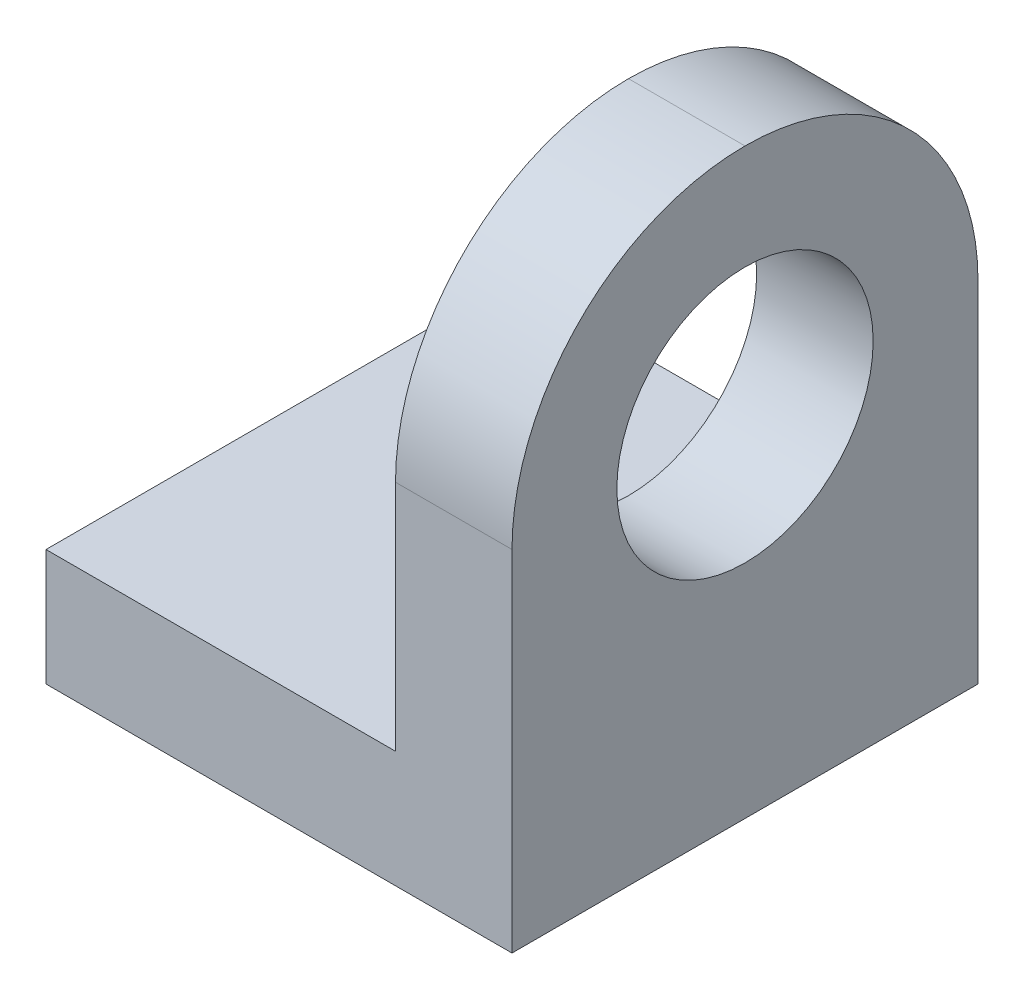
ISO-10303-21;
HEADER;
FILE_DESCRIPTION(('STEP AP214'),'2;1');
FILE_NAME('part.step','',(''),(''),'','','');
FILE_SCHEMA(('AUTOMOTIVE_DESIGN { 1 0 10303 214 1 1 1 1 }'));
ENDSEC;
DATA;
#1=APPLICATION_CONTEXT('core data for automotive mechanical design processes');
#2=APPLICATION_PROTOCOL_DEFINITION('international standard','automotive_design',2000,#1);
#3=PRODUCT_CONTEXT('',#1,'mechanical');
#4=PRODUCT('Part','Part','',(#3));
#5=PRODUCT_RELATED_PRODUCT_CATEGORY('part','',(#4));
#6=PRODUCT_DEFINITION_FORMATION('','',#4);
#7=PRODUCT_DEFINITION_CONTEXT('part definition',#1,'design');
#8=PRODUCT_DEFINITION('design','',#6,#7);
#9=PRODUCT_DEFINITION_SHAPE('','',#8);
#10=(LENGTH_UNIT() NAMED_UNIT(*) SI_UNIT(.MILLI.,.METRE.));
#11=(NAMED_UNIT(*) PLANE_ANGLE_UNIT() SI_UNIT($,.RADIAN.));
#12=(NAMED_UNIT(*) SI_UNIT($,.STERADIAN.) SOLID_ANGLE_UNIT());
#13=UNCERTAINTY_MEASURE_WITH_UNIT(LENGTH_MEASURE(1.E-05),#10,'distance_accuracy_value','');
#14=(GEOMETRIC_REPRESENTATION_CONTEXT(3) GLOBAL_UNCERTAINTY_ASSIGNED_CONTEXT((#13)) GLOBAL_UNIT_ASSIGNED_CONTEXT((#10,
#11,#12)) REPRESENTATION_CONTEXT('',''));
#15=CARTESIAN_POINT('',(0.,0.,0.));
#16=DIRECTION('',(0.,0.,1.));
#17=DIRECTION('',(1.,0.,0.));
#18=AXIS2_PLACEMENT_3D('',#15,#16,#17);
#19=CARTESIAN_POINT('',(9.99999999999999,5.,-10.));
#20=DIRECTION('',(-1.,0.,0.));
#21=DIRECTION('',(0.,0.,1.));
#22=AXIS2_PLACEMENT_3D('',#19,#20,#21);
#23=PLANE('',#22);
#24=CARTESIAN_POINT('',(10.,15.,0.));
#25=DIRECTION('',(1.,0.,0.));
#26=DIRECTION('',(0.,0.,-1.));
#27=AXIS2_PLACEMENT_3D('',#24,#25,#26);
#28=CIRCLE('',#27,5.5);
#29=CARTESIAN_POINT('',(10.,15.,-5.5));
#30=VERTEX_POINT('',#29);
#31=EDGE_CURVE('E120',#30,#30,#28,.T.);
#32=ORIENTED_EDGE('',*,*,#31,.F.);
#33=EDGE_LOOP('',(#32));
#34=FACE_BOUND('',#33,.T.);
#35=DIRECTION('',(0.,-1.,0.));
#36=VECTOR('',#35,1.);
#37=CARTESIAN_POINT('',(9.99999999999999,5.,-10.));
#38=LINE('',#37,#36);
#39=CARTESIAN_POINT('',(9.99999999999999,15.,-10.));
#40=VERTEX_POINT('',#39);
#41=CARTESIAN_POINT('',(9.99999999999999,0.,-10.));
#42=VERTEX_POINT('',#41);
#43=EDGE_CURVE('E145',#40,#42,#38,.T.);
#44=ORIENTED_EDGE('',*,*,#43,.F.);
#45=CARTESIAN_POINT('',(10.,15.,0.));
#46=DIRECTION('',(-1.,0.,0.));
#47=DIRECTION('',(0.,0.,1.));
#48=AXIS2_PLACEMENT_3D('',#45,#46,#47);
#49=CIRCLE('',#48,10.);
#50=CARTESIAN_POINT('',(10.,25.,0.));
#51=VERTEX_POINT('',#50);
#52=EDGE_CURVE('E50',#40,#51,#49,.F.);
#53=ORIENTED_EDGE('',*,*,#52,.T.);
#54=CARTESIAN_POINT('',(10.,15.,0.));
#55=DIRECTION('',(-1.,0.,0.));
#56=DIRECTION('',(0.,0.,1.));
#57=AXIS2_PLACEMENT_3D('',#54,#55,#56);
#58=CIRCLE('',#57,10.);
#59=CARTESIAN_POINT('',(10.,15.,10.));
#60=VERTEX_POINT('',#59);
#61=EDGE_CURVE('E53',#51,#60,#58,.F.);
#62=ORIENTED_EDGE('',*,*,#61,.T.);
#63=DIRECTION('',(0.,-1.,0.));
#64=VECTOR('',#63,1.);
#65=CARTESIAN_POINT('',(10.,5.,10.));
#66=LINE('',#65,#64);
#67=CARTESIAN_POINT('',(10.,0.,10.));
#68=VERTEX_POINT('',#67);
#69=EDGE_CURVE('E114',#60,#68,#66,.T.);
#70=ORIENTED_EDGE('',*,*,#69,.T.);
#71=DIRECTION('',(0.,0.,-1.));
#72=VECTOR('',#71,1.);
#73=CARTESIAN_POINT('',(9.99999999999999,0.,-10.));
#74=LINE('',#73,#72);
#75=EDGE_CURVE('E123',#68,#42,#74,.T.);
#76=ORIENTED_EDGE('',*,*,#75,.T.);
#77=EDGE_LOOP('',(#44,#53,#62,#70,#76));
#78=FACE_BOUND('',#77,.T.);
#79=ADVANCED_FACE('F36',(#34,#78),#23,.F.);
#80=CARTESIAN_POINT('',(-10.,5.,-10.));
#81=DIRECTION('',(0.,0.,1.));
#82=DIRECTION('',(1.,0.,0.));
#83=AXIS2_PLACEMENT_3D('',#80,#81,#82);
#84=PLANE('',#83);
#85=DIRECTION('',(0.,-1.,0.));
#86=VECTOR('',#85,1.);
#87=CARTESIAN_POINT('',(5.,25.,-10.));
#88=LINE('',#87,#86);
#89=CARTESIAN_POINT('',(5.,15.,-10.));
#90=VERTEX_POINT('',#89);
#91=CARTESIAN_POINT('',(5.,5.,-10.));
#92=VERTEX_POINT('',#91);
#93=EDGE_CURVE('E103',#90,#92,#88,.T.);
#94=ORIENTED_EDGE('',*,*,#93,.F.);
#95=DIRECTION('',(-1.,0.,0.));
#96=VECTOR('',#95,1.);
#97=CARTESIAN_POINT('',(-10.,15.,-10.));
#98=LINE('',#97,#96);
#99=EDGE_CURVE('E147',#90,#40,#98,.F.);
#100=ORIENTED_EDGE('',*,*,#99,.T.);
#101=ORIENTED_EDGE('',*,*,#43,.T.);
#102=DIRECTION('',(-1.,0.,0.));
#103=VECTOR('',#102,1.);
#104=CARTESIAN_POINT('',(-10.,0.,-10.));
#105=LINE('',#104,#103);
#106=CARTESIAN_POINT('',(-10.,0.,-10.));
#107=VERTEX_POINT('',#106);
#108=EDGE_CURVE('E132',#42,#107,#105,.T.);
#109=ORIENTED_EDGE('',*,*,#108,.T.);
#110=DIRECTION('',(0.,-1.,0.));
#111=VECTOR('',#110,1.);
#112=CARTESIAN_POINT('',(-10.,5.,-10.));
#113=LINE('',#112,#111);
#114=CARTESIAN_POINT('',(-10.,5.,-10.));
#115=VERTEX_POINT('',#114);
#116=EDGE_CURVE('E143',#115,#107,#113,.T.);
#117=ORIENTED_EDGE('',*,*,#116,.F.);
#118=DIRECTION('',(-1.,0.,0.));
#119=VECTOR('',#118,1.);
#120=CARTESIAN_POINT('',(-10.,5.,-10.));
#121=LINE('',#120,#119);
#122=EDGE_CURVE('E127',#92,#115,#121,.T.);
#123=ORIENTED_EDGE('',*,*,#122,.F.);
#124=EDGE_LOOP('',(#94,#100,#101,#109,#117,#123));
#125=FACE_BOUND('',#124,.T.);
#126=ADVANCED_FACE('F156',(#125),#84,.F.);
#127=CARTESIAN_POINT('',(-10.,5.,-10.));
#128=DIRECTION('',(1.,0.,0.));
#129=DIRECTION('',(0.,0.,-1.));
#130=AXIS2_PLACEMENT_3D('',#127,#128,#129);
#131=PLANE('',#130);
#132=DIRECTION('',(0.,0.,1.));
#133=VECTOR('',#132,1.);
#134=CARTESIAN_POINT('',(-10.,0.,-10.));
#135=LINE('',#134,#133);
#136=CARTESIAN_POINT('',(-10.,0.,10.));
#137=VERTEX_POINT('',#136);
#138=EDGE_CURVE('E133',#107,#137,#135,.T.);
#139=ORIENTED_EDGE('',*,*,#138,.T.);
#140=DIRECTION('',(0.,-1.,0.));
#141=VECTOR('',#140,1.);
#142=CARTESIAN_POINT('',(-10.,5.,10.));
#143=LINE('',#142,#141);
#144=CARTESIAN_POINT('',(-10.,5.,10.));
#145=VERTEX_POINT('',#144);
#146=EDGE_CURVE('E136',#145,#137,#143,.T.);
#147=ORIENTED_EDGE('',*,*,#146,.F.);
#148=DIRECTION('',(0.,0.,1.));
#149=VECTOR('',#148,1.);
#150=CARTESIAN_POINT('',(-10.,5.,-10.));
#151=LINE('',#150,#149);
#152=EDGE_CURVE('E112',#115,#145,#151,.T.);
#153=ORIENTED_EDGE('',*,*,#152,.F.);
#154=ORIENTED_EDGE('',*,*,#116,.T.);
#155=EDGE_LOOP('',(#139,#147,#153,#154));
#156=FACE_BOUND('',#155,.T.);
#157=ADVANCED_FACE('F170',(#156),#131,.F.);
#158=CARTESIAN_POINT('',(-10.,5.,10.));
#159=DIRECTION('',(0.,0.,-1.));
#160=DIRECTION('',(-1.,0.,0.));
#161=AXIS2_PLACEMENT_3D('',#158,#159,#160);
#162=PLANE('',#161);
#163=ORIENTED_EDGE('',*,*,#69,.F.);
#164=DIRECTION('',(1.,0.,0.));
#165=VECTOR('',#164,1.);
#166=CARTESIAN_POINT('',(-10.,15.,10.));
#167=LINE('',#166,#165);
#168=CARTESIAN_POINT('',(5.,15.,10.));
#169=VERTEX_POINT('',#168);
#170=EDGE_CURVE('E11',#60,#169,#167,.F.);
#171=ORIENTED_EDGE('',*,*,#170,.T.);
#172=DIRECTION('',(0.,-1.,0.));
#173=VECTOR('',#172,1.);
#174=CARTESIAN_POINT('',(5.,25.,10.));
#175=LINE('',#174,#173);
#176=CARTESIAN_POINT('',(5.,5.,10.));
#177=VERTEX_POINT('',#176);
#178=EDGE_CURVE('E94',#169,#177,#175,.T.);
#179=ORIENTED_EDGE('',*,*,#178,.T.);
#180=DIRECTION('',(1.,0.,0.));
#181=VECTOR('',#180,1.);
#182=CARTESIAN_POINT('',(-10.,5.,10.));
#183=LINE('',#182,#181);
#184=EDGE_CURVE('E98',#145,#177,#183,.T.);
#185=ORIENTED_EDGE('',*,*,#184,.F.);
#186=ORIENTED_EDGE('',*,*,#146,.T.);
#187=DIRECTION('',(1.,0.,0.));
#188=VECTOR('',#187,1.);
#189=CARTESIAN_POINT('',(-10.,0.,10.));
#190=LINE('',#189,#188);
#191=EDGE_CURVE('E126',#137,#68,#190,.T.);
#192=ORIENTED_EDGE('',*,*,#191,.T.);
#193=EDGE_LOOP('',(#163,#171,#179,#185,#186,#192));
#194=FACE_BOUND('',#193,.T.);
#195=ADVANCED_FACE('F96',(#194),#162,.F.);
#196=CARTESIAN_POINT('',(0.,5.,0.));
#197=DIRECTION('',(0.,1.,0.));
#198=DIRECTION('',(0.,0.,1.));
#199=AXIS2_PLACEMENT_3D('',#196,#197,#198);
#200=PLANE('',#199);
#201=DIRECTION('',(0.,0.,1.));
#202=VECTOR('',#201,1.);
#203=CARTESIAN_POINT('',(5.,5.,-10.));
#204=LINE('',#203,#202);
#205=EDGE_CURVE('E102',#92,#177,#204,.T.);
#206=ORIENTED_EDGE('',*,*,#205,.F.);
#207=ORIENTED_EDGE('',*,*,#122,.T.);
#208=ORIENTED_EDGE('',*,*,#152,.T.);
#209=ORIENTED_EDGE('',*,*,#184,.T.);
#210=EDGE_LOOP('',(#206,#207,#208,#209));
#211=FACE_BOUND('',#210,.T.);
#212=ADVANCED_FACE('F107',(#211),#200,.T.);
#213=CARTESIAN_POINT('',(0.,0.,0.));
#214=DIRECTION('',(0.,1.,0.));
#215=DIRECTION('',(0.,0.,1.));
#216=AXIS2_PLACEMENT_3D('',#213,#214,#215);
#217=PLANE('',#216);
#218=ORIENTED_EDGE('',*,*,#75,.F.);
#219=ORIENTED_EDGE('',*,*,#191,.F.);
#220=ORIENTED_EDGE('',*,*,#138,.F.);
#221=ORIENTED_EDGE('',*,*,#108,.F.);
#222=EDGE_LOOP('',(#218,#219,#220,#221));
#223=FACE_BOUND('',#222,.T.);
#224=ADVANCED_FACE('F162',(#223),#217,.F.);
#225=CARTESIAN_POINT('',(5.,25.,-10.));
#226=DIRECTION('',(1.,0.,0.));
#227=DIRECTION('',(0.,0.,-1.));
#228=AXIS2_PLACEMENT_3D('',#225,#226,#227);
#229=PLANE('',#228);
#230=CARTESIAN_POINT('',(5.,15.,0.));
#231=DIRECTION('',(1.,0.,0.));
#232=DIRECTION('',(0.,0.,-1.));
#233=AXIS2_PLACEMENT_3D('',#230,#231,#232);
#234=CIRCLE('',#233,5.5);
#235=CARTESIAN_POINT('',(5.,15.,-5.5));
#236=VERTEX_POINT('',#235);
#237=EDGE_CURVE('E117',#236,#236,#234,.T.);
#238=ORIENTED_EDGE('',*,*,#237,.T.);
#239=EDGE_LOOP('',(#238));
#240=FACE_BOUND('',#239,.T.);
#241=CARTESIAN_POINT('',(5.,15.,0.));
#242=DIRECTION('',(1.,0.,0.));
#243=DIRECTION('',(0.,0.,-1.));
#244=AXIS2_PLACEMENT_3D('',#241,#242,#243);
#245=CIRCLE('',#244,10.);
#246=CARTESIAN_POINT('',(5.,25.,0.));
#247=VERTEX_POINT('',#246);
#248=EDGE_CURVE('E144',#169,#247,#245,.F.);
#249=ORIENTED_EDGE('',*,*,#248,.T.);
#250=CARTESIAN_POINT('',(5.,15.,0.));
#251=DIRECTION('',(1.,0.,0.));
#252=DIRECTION('',(0.,0.,-1.));
#253=AXIS2_PLACEMENT_3D('',#250,#251,#252);
#254=CIRCLE('',#253,10.);
#255=EDGE_CURVE('E146',#247,#90,#254,.F.);
#256=ORIENTED_EDGE('',*,*,#255,.T.);
#257=ORIENTED_EDGE('',*,*,#93,.T.);
#258=ORIENTED_EDGE('',*,*,#205,.T.);
#259=ORIENTED_EDGE('',*,*,#178,.F.);
#260=EDGE_LOOP('',(#249,#256,#257,#258,#259));
#261=FACE_BOUND('',#260,.T.);
#262=ADVANCED_FACE('F113',(#240,#261),#229,.F.);
#263=CARTESIAN_POINT('',(-10.,15.,0.));
#264=DIRECTION('',(1.,0.,0.));
#265=DIRECTION('',(0.,0.,-1.));
#266=AXIS2_PLACEMENT_3D('',#263,#264,#265);
#267=CYLINDRICAL_SURFACE('',#266,5.5);
#268=CARTESIAN_POINT('',(10.,15.,-5.5));
#269=CARTESIAN_POINT('',(9.94791666666667,15.,-5.5));
#270=CARTESIAN_POINT('',(9.89583333333333,15.,-5.5));
#271=CARTESIAN_POINT('',(9.79166666666667,15.,-5.5));
#272=CARTESIAN_POINT('',(9.73958333333333,15.,-5.5));
#273=CARTESIAN_POINT('',(9.63541666666667,15.,-5.5));
#274=CARTESIAN_POINT('',(9.58333333333333,15.,-5.5));
#275=CARTESIAN_POINT('',(9.47916666666667,15.,-5.5));
#276=CARTESIAN_POINT('',(9.42708333333333,15.,-5.5));
#277=CARTESIAN_POINT('',(9.32291666666666,15.,-5.5));
#278=CARTESIAN_POINT('',(9.27083333333333,15.,-5.5));
#279=CARTESIAN_POINT('',(9.16666666666666,15.,-5.5));
#280=CARTESIAN_POINT('',(9.11458333333333,15.,-5.5));
#281=CARTESIAN_POINT('',(9.01041666666666,15.,-5.5));
#282=CARTESIAN_POINT('',(8.95833333333333,15.,-5.5));
#283=CARTESIAN_POINT('',(8.85416666666666,15.,-5.5));
#284=CARTESIAN_POINT('',(8.80208333333333,15.,-5.5));
#285=CARTESIAN_POINT('',(8.69791666666666,15.,-5.5));
#286=CARTESIAN_POINT('',(8.64583333333333,15.,-5.5));
#287=CARTESIAN_POINT('',(8.54166666666666,15.,-5.5));
#288=CARTESIAN_POINT('',(8.48958333333333,15.,-5.5));
#289=CARTESIAN_POINT('',(8.38541666666666,15.,-5.5));
#290=CARTESIAN_POINT('',(8.33333333333333,15.,-5.5));
#291=CARTESIAN_POINT('',(8.22916666666666,15.,-5.5));
#292=CARTESIAN_POINT('',(8.17708333333333,15.,-5.5));
#293=CARTESIAN_POINT('',(8.07291666666666,15.,-5.5));
#294=CARTESIAN_POINT('',(8.02083333333333,15.,-5.5));
#295=CARTESIAN_POINT('',(7.91666666666666,15.,-5.5));
#296=CARTESIAN_POINT('',(7.86458333333333,15.,-5.5));
#297=CARTESIAN_POINT('',(7.76041666666666,15.,-5.5));
#298=CARTESIAN_POINT('',(7.70833333333333,15.,-5.5));
#299=CARTESIAN_POINT('',(7.60416666666667,15.,-5.5));
#300=CARTESIAN_POINT('',(7.55208333333333,15.,-5.5));
#301=CARTESIAN_POINT('',(7.44791666666666,15.,-5.5));
#302=CARTESIAN_POINT('',(7.39583333333333,15.,-5.5));
#303=CARTESIAN_POINT('',(7.29166666666667,15.,-5.5));
#304=CARTESIAN_POINT('',(7.23958333333333,15.,-5.5));
#305=CARTESIAN_POINT('',(7.13541666666666,15.,-5.5));
#306=CARTESIAN_POINT('',(7.08333333333333,15.,-5.5));
#307=CARTESIAN_POINT('',(6.97916666666667,15.,-5.5));
#308=CARTESIAN_POINT('',(6.92708333333333,15.,-5.5));
#309=CARTESIAN_POINT('',(6.82291666666667,15.,-5.5));
#310=CARTESIAN_POINT('',(6.77083333333333,15.,-5.5));
#311=CARTESIAN_POINT('',(6.66666666666667,15.,-5.5));
#312=CARTESIAN_POINT('',(6.61458333333333,15.,-5.5));
#313=CARTESIAN_POINT('',(6.51041666666667,15.,-5.5));
#314=CARTESIAN_POINT('',(6.45833333333333,15.,-5.5));
#315=CARTESIAN_POINT('',(6.35416666666667,15.,-5.5));
#316=CARTESIAN_POINT('',(6.30208333333333,15.,-5.5));
#317=CARTESIAN_POINT('',(6.19791666666667,15.,-5.5));
#318=CARTESIAN_POINT('',(6.14583333333333,15.,-5.5));
#319=CARTESIAN_POINT('',(6.04166666666667,15.,-5.5));
#320=CARTESIAN_POINT('',(5.98958333333333,15.,-5.5));
#321=CARTESIAN_POINT('',(5.88541666666666,15.,-5.5));
#322=CARTESIAN_POINT('',(5.83333333333333,15.,-5.5));
#323=CARTESIAN_POINT('',(5.72916666666666,15.,-5.5));
#324=CARTESIAN_POINT('',(5.67708333333333,15.,-5.5));
#325=CARTESIAN_POINT('',(5.57291666666667,15.,-5.5));
#326=CARTESIAN_POINT('',(5.52083333333333,15.,-5.5));
#327=CARTESIAN_POINT('',(5.41666666666667,15.,-5.5));
#328=CARTESIAN_POINT('',(5.36458333333333,15.,-5.5));
#329=CARTESIAN_POINT('',(5.26041666666667,15.,-5.5));
#330=CARTESIAN_POINT('',(5.20833333333333,15.,-5.5));
#331=CARTESIAN_POINT('',(5.10416666666667,15.,-5.5));
#332=CARTESIAN_POINT('',(5.05208333333333,15.,-5.5));
#333=CARTESIAN_POINT('',(5.,15.,-5.5));
#334=B_SPLINE_CURVE_WITH_KNOTS('',3,(#268,#269,#270,#271,#272,#273,#274,#275,#276,#277,#278,
#279,#280,#281,#282,#283,#284,#285,#286,#287,#288,#289,#290,#291,#292,#293,#294,#295,#296,#297,
#298,#299,#300,#301,#302,#303,#304,#305,#306,#307,#308,#309,#310,#311,#312,#313,#314,#315,#316,
#317,#318,#319,#320,#321,#322,#323,#324,#325,#326,#327,#328,#329,#330,#331,#332,#333),
.UNSPECIFIED.,.F.,.F.,(4,2,2,2,2,2,2,2,2,2,2,2,2,2,2,2,2,2,2,2,2,2,2,2,2,2,2,2,2,2,2,2,4),(0.,
0.15625,0.3125,0.46875,0.625000000000001,0.781250000000001,0.937500000000001,1.09375,1.25,
1.40625,1.5625,1.71875,1.875,2.03125,2.1875,2.34375,2.5,2.65625,2.8125,2.96875,3.125,3.28125,
3.4375,3.59375,3.75,3.90625,4.0625,4.21875,4.375,4.53125,4.6875,4.84375,5.),.UNSPECIFIED.);
#335=EDGE_CURVE('BSEAM175',#30,#236,#334,.T.);
#336=ORIENTED_EDGE('',*,*,#31,.T.);
#337=ORIENTED_EDGE('',*,*,#237,.F.);
#338=ORIENTED_EDGE('',*,*,#335,.T.);
#339=ORIENTED_EDGE('',*,*,#335,.F.);
#340=EDGE_LOOP('',(#336,#338,#337,#339));
#341=FACE_BOUND('',#340,.T.);
#342=ADVANCED_FACE('F175',(#341),#267,.F.);
#343=CARTESIAN_POINT('',(0.,15.,0.));
#344=DIRECTION('',(1.,0.,0.));
#345=DIRECTION('',(0.,0.,-1.));
#346=AXIS2_PLACEMENT_3D('',#343,#344,#345);
#347=CYLINDRICAL_SURFACE('',#346,10.);
#348=ORIENTED_EDGE('',*,*,#170,.F.);
#349=ORIENTED_EDGE('',*,*,#61,.F.);
#350=DIRECTION('',(1.,0.,0.));
#351=VECTOR('',#350,1.);
#352=CARTESIAN_POINT('',(0.,25.,0.));
#353=LINE('',#352,#351);
#354=EDGE_CURVE('E45',#247,#51,#353,.T.);
#355=ORIENTED_EDGE('',*,*,#354,.F.);
#356=ORIENTED_EDGE('',*,*,#248,.F.);
#357=EDGE_LOOP('',(#348,#349,#355,#356));
#358=FACE_BOUND('',#357,.T.);
#359=ADVANCED_FACE('F37',(#358),#347,.T.);
#360=CARTESIAN_POINT('',(0.,15.,0.));
#361=DIRECTION('',(-1.,0.,0.));
#362=DIRECTION('',(0.,0.,1.));
#363=AXIS2_PLACEMENT_3D('',#360,#361,#362);
#364=CYLINDRICAL_SURFACE('',#363,10.);
#365=ORIENTED_EDGE('',*,*,#52,.F.);
#366=ORIENTED_EDGE('',*,*,#99,.F.);
#367=ORIENTED_EDGE('',*,*,#255,.F.);
#368=ORIENTED_EDGE('',*,*,#354,.T.);
#369=EDGE_LOOP('',(#365,#366,#367,#368));
#370=FACE_BOUND('',#369,.T.);
#371=ADVANCED_FACE('F171',(#370),#364,.T.);
#372=CLOSED_SHELL('',(#79,#126,#157,#195,#212,#224,#262,#342,#359,#371));
#373=MANIFOLD_SOLID_BREP('B2',#372);
#374=ADVANCED_BREP_SHAPE_REPRESENTATION('',(#18,#373),#14);
#375=SHAPE_DEFINITION_REPRESENTATION(#9,#374);
ENDSEC;
END-ISO-10303-21;
